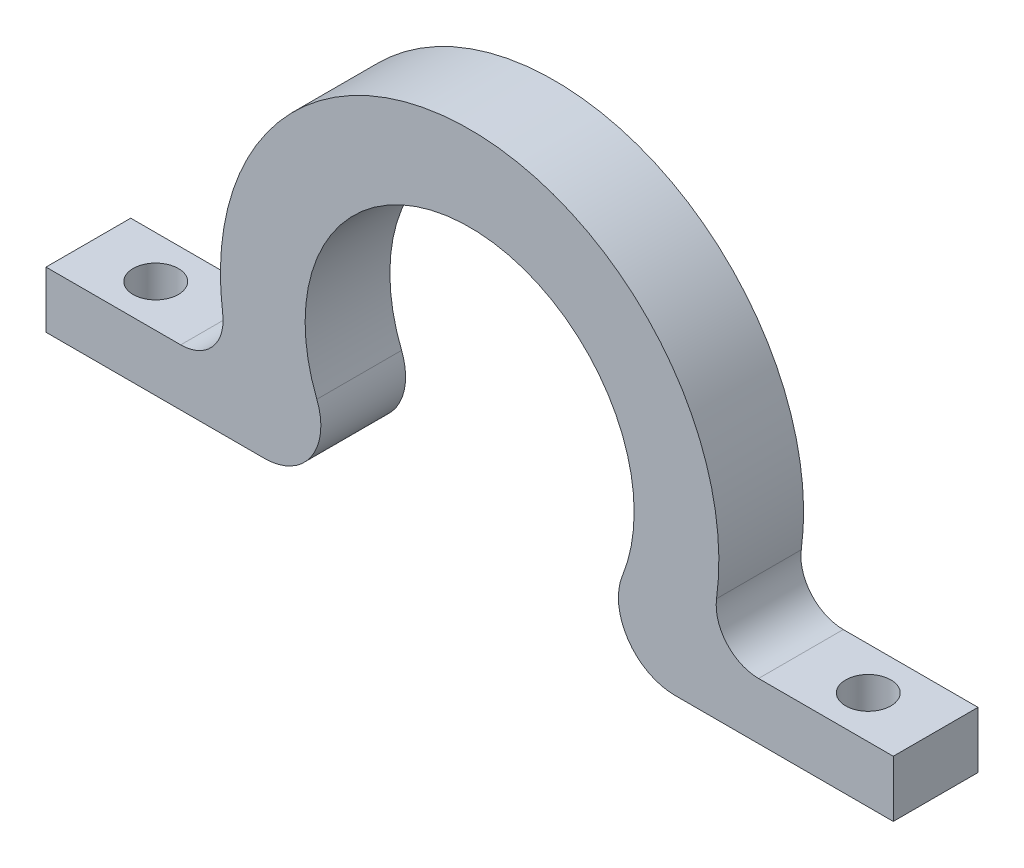
ISO-10303-21;
HEADER;
FILE_DESCRIPTION(('STEP AP214'),'2;1');
FILE_NAME('part.step','',(''),(''),'','','');
FILE_SCHEMA(('AUTOMOTIVE_DESIGN { 1 0 10303 214 1 1 1 1 }'));
ENDSEC;
DATA;
#1=APPLICATION_CONTEXT('core data for automotive mechanical design processes');
#2=APPLICATION_PROTOCOL_DEFINITION('international standard','automotive_design',2000,#1);
#3=PRODUCT_CONTEXT('',#1,'mechanical');
#4=PRODUCT('Part','Part','',(#3));
#5=PRODUCT_RELATED_PRODUCT_CATEGORY('part','',(#4));
#6=PRODUCT_DEFINITION_FORMATION('','',#4);
#7=PRODUCT_DEFINITION_CONTEXT('part definition',#1,'design');
#8=PRODUCT_DEFINITION('design','',#6,#7);
#9=PRODUCT_DEFINITION_SHAPE('','',#8);
#10=(LENGTH_UNIT() NAMED_UNIT(*) SI_UNIT(.MILLI.,.METRE.));
#11=(NAMED_UNIT(*) PLANE_ANGLE_UNIT() SI_UNIT($,.RADIAN.));
#12=(NAMED_UNIT(*) SI_UNIT($,.STERADIAN.) SOLID_ANGLE_UNIT());
#13=UNCERTAINTY_MEASURE_WITH_UNIT(LENGTH_MEASURE(1.E-05),#10,'distance_accuracy_value','');
#14=(GEOMETRIC_REPRESENTATION_CONTEXT(3) GLOBAL_UNCERTAINTY_ASSIGNED_CONTEXT((#13)) GLOBAL_UNIT_ASSIGNED_CONTEXT((#10,
#11,#12)) REPRESENTATION_CONTEXT('',''));
#15=CARTESIAN_POINT('',(0.,0.,0.));
#16=DIRECTION('',(0.,0.,1.));
#17=DIRECTION('',(1.,0.,0.));
#18=AXIS2_PLACEMENT_3D('',#15,#16,#17);
#19=CARTESIAN_POINT('',(-30.,-9.8,6.));
#20=DIRECTION('',(1.,0.,0.));
#21=DIRECTION('',(0.,0.,-1.));
#22=AXIS2_PLACEMENT_3D('',#19,#20,#21);
#23=PLANE('',#22);
#24=DIRECTION('',(0.,-1.,0.));
#25=VECTOR('',#24,1.);
#26=CARTESIAN_POINT('',(-30.,-9.8,0.));
#27=LINE('',#26,#25);
#28=CARTESIAN_POINT('',(-30.,-5.80000000000001,0.));
#29=VERTEX_POINT('',#28);
#30=CARTESIAN_POINT('',(-30.,-9.8,0.));
#31=VERTEX_POINT('',#30);
#32=EDGE_CURVE('E169',#29,#31,#27,.T.);
#33=ORIENTED_EDGE('',*,*,#32,.T.);
#34=DIRECTION('',(0.,0.,-1.));
#35=VECTOR('',#34,1.);
#36=CARTESIAN_POINT('',(-30.,-9.8,6.));
#37=LINE('',#36,#35);
#38=CARTESIAN_POINT('',(-30.,-9.8,6.));
#39=VERTEX_POINT('',#38);
#40=EDGE_CURVE('E11',#39,#31,#37,.T.);
#41=ORIENTED_EDGE('',*,*,#40,.F.);
#42=DIRECTION('',(0.,-1.,0.));
#43=VECTOR('',#42,1.);
#44=CARTESIAN_POINT('',(-30.,-9.8,6.));
#45=LINE('',#44,#43);
#46=CARTESIAN_POINT('',(-30.,-5.80000000000001,6.));
#47=VERTEX_POINT('',#46);
#48=EDGE_CURVE('E204',#47,#39,#45,.T.);
#49=ORIENTED_EDGE('',*,*,#48,.F.);
#50=DIRECTION('',(0.,0.,-1.));
#51=VECTOR('',#50,1.);
#52=CARTESIAN_POINT('',(-30.,-5.80000000000001,6.));
#53=LINE('',#52,#51);
#54=EDGE_CURVE('E165',#47,#29,#53,.T.);
#55=ORIENTED_EDGE('',*,*,#54,.T.);
#56=EDGE_LOOP('',(#33,#41,#49,#55));
#57=FACE_BOUND('',#56,.T.);
#58=ADVANCED_FACE('F44',(#57),#23,.F.);
#59=CARTESIAN_POINT('',(-14.5355598447394,-9.8,6.));
#60=DIRECTION('',(0.,1.,0.));
#61=DIRECTION('',(-1.,0.,0.));
#62=AXIS2_PLACEMENT_3D('',#59,#60,#61);
#63=PLANE('',#62);
#64=CARTESIAN_POINT('',(-25.2296444219728,-9.8,3.));
#65=DIRECTION('',(0.,1.,0.));
#66=DIRECTION('',(0.,0.,1.));
#67=AXIS2_PLACEMENT_3D('',#64,#65,#66);
#68=CIRCLE('',#67,1.6);
#69=CARTESIAN_POINT('',(-25.2296444219728,-9.8,4.6));
#70=VERTEX_POINT('',#69);
#71=EDGE_CURVE('E174',#70,#70,#68,.T.);
#72=ORIENTED_EDGE('',*,*,#71,.T.);
#73=EDGE_LOOP('',(#72));
#74=FACE_BOUND('',#73,.T.);
#75=DIRECTION('',(1.,0.,0.));
#76=VECTOR('',#75,1.);
#77=CARTESIAN_POINT('',(-14.5355598447394,-9.8,0.));
#78=LINE('',#77,#76);
#79=CARTESIAN_POINT('',(-14.5355598447394,-9.8,0.));
#80=VERTEX_POINT('',#79);
#81=EDGE_CURVE('E173',#31,#80,#78,.T.);
#82=ORIENTED_EDGE('',*,*,#81,.T.);
#83=DIRECTION('',(0.,0.,-1.));
#84=VECTOR('',#83,1.);
#85=CARTESIAN_POINT('',(-14.5355598447394,-9.8,6.));
#86=LINE('',#85,#84);
#87=CARTESIAN_POINT('',(-14.5355598447394,-9.8,6.));
#88=VERTEX_POINT('',#87);
#89=EDGE_CURVE('E53',#88,#80,#86,.T.);
#90=ORIENTED_EDGE('',*,*,#89,.F.);
#91=DIRECTION('',(1.,0.,0.));
#92=VECTOR('',#91,1.);
#93=CARTESIAN_POINT('',(-14.5355598447394,-9.8,6.));
#94=LINE('',#93,#92);
#95=EDGE_CURVE('E116',#39,#88,#94,.T.);
#96=ORIENTED_EDGE('',*,*,#95,.F.);
#97=ORIENTED_EDGE('',*,*,#40,.T.);
#98=EDGE_LOOP('',(#82,#90,#96,#97));
#99=FACE_BOUND('',#98,.T.);
#100=ADVANCED_FACE('F302',(#74,#99),#63,.F.);
#101=CARTESIAN_POINT('',(-14.5355598447394,-5.8,6.));
#102=DIRECTION('',(0.,0.,-1.));
#103=DIRECTION('',(-1.,0.,0.));
#104=AXIS2_PLACEMENT_3D('',#101,#102,#103);
#105=CYLINDRICAL_SURFACE('',#104,4.);
#106=CARTESIAN_POINT('',(-14.5355598447394,-5.8,0.));
#107=DIRECTION('',(0.,0.,1.));
#108=DIRECTION('',(1.,0.,0.));
#109=AXIS2_PLACEMENT_3D('',#106,#107,#108);
#110=CIRCLE('',#109,4.);
#111=CARTESIAN_POINT('',(-10.8204007789913,-4.31757188498403,0.));
#112=VERTEX_POINT('',#111);
#113=EDGE_CURVE('E177',#80,#112,#110,.T.);
#114=ORIENTED_EDGE('',*,*,#113,.T.);
#115=DIRECTION('',(0.,0.,-1.));
#116=VECTOR('',#115,1.);
#117=CARTESIAN_POINT('',(-10.8204007789913,-4.31757188498403,6.));
#118=LINE('',#117,#116);
#119=CARTESIAN_POINT('',(-10.8204007789913,-4.31757188498403,6.));
#120=VERTEX_POINT('',#119);
#121=EDGE_CURVE('E231',#120,#112,#118,.T.);
#122=ORIENTED_EDGE('',*,*,#121,.F.);
#123=CARTESIAN_POINT('',(-14.5355598447394,-5.8,6.));
#124=DIRECTION('',(0.,0.,1.));
#125=DIRECTION('',(1.,0.,0.));
#126=AXIS2_PLACEMENT_3D('',#123,#124,#125);
#127=CIRCLE('',#126,4.);
#128=EDGE_CURVE('E241',#88,#120,#127,.T.);
#129=ORIENTED_EDGE('',*,*,#128,.F.);
#130=ORIENTED_EDGE('',*,*,#89,.T.);
#131=EDGE_LOOP('',(#114,#122,#129,#130));
#132=FACE_BOUND('',#131,.T.);
#133=ADVANCED_FACE('F239',(#132),#105,.T.);
#134=CARTESIAN_POINT('',(0.,0.,6.));
#135=DIRECTION('',(0.,0.,-1.));
#136=DIRECTION('',(-1.,0.,0.));
#137=AXIS2_PLACEMENT_3D('',#134,#135,#136);
#138=CYLINDRICAL_SURFACE('',#137,11.65);
#139=CARTESIAN_POINT('',(0.,0.,0.));
#140=DIRECTION('',(0.,0.,-1.));
#141=DIRECTION('',(1.,0.,0.));
#142=AXIS2_PLACEMENT_3D('',#139,#140,#141);
#143=CIRCLE('',#142,11.65);
#144=CARTESIAN_POINT('',(10.8204007789913,-4.31757188498403,0.));
#145=VERTEX_POINT('',#144);
#146=EDGE_CURVE('E180',#112,#145,#143,.T.);
#147=ORIENTED_EDGE('',*,*,#146,.T.);
#148=DIRECTION('',(0.,0.,-1.));
#149=VECTOR('',#148,1.);
#150=CARTESIAN_POINT('',(10.8204007789913,-4.31757188498403,6.));
#151=LINE('',#150,#149);
#152=CARTESIAN_POINT('',(10.8204007789913,-4.31757188498403,6.));
#153=VERTEX_POINT('',#152);
#154=EDGE_CURVE('E227',#153,#145,#151,.T.);
#155=ORIENTED_EDGE('',*,*,#154,.F.);
#156=CARTESIAN_POINT('',(0.,0.,6.));
#157=DIRECTION('',(0.,0.,-1.));
#158=DIRECTION('',(1.,0.,0.));
#159=AXIS2_PLACEMENT_3D('',#156,#157,#158);
#160=CIRCLE('',#159,11.65);
#161=EDGE_CURVE('E260',#120,#153,#160,.T.);
#162=ORIENTED_EDGE('',*,*,#161,.F.);
#163=ORIENTED_EDGE('',*,*,#121,.T.);
#164=EDGE_LOOP('',(#147,#155,#162,#163));
#165=FACE_BOUND('',#164,.T.);
#166=ADVANCED_FACE('F250',(#165),#138,.F.);
#167=CARTESIAN_POINT('',(14.5355598447394,-5.8,6.));
#168=DIRECTION('',(0.,0.,-1.));
#169=DIRECTION('',(-1.,0.,0.));
#170=AXIS2_PLACEMENT_3D('',#167,#168,#169);
#171=CYLINDRICAL_SURFACE('',#170,4.);
#172=CARTESIAN_POINT('',(14.5355598447394,-5.8,0.));
#173=DIRECTION('',(0.,0.,1.));
#174=DIRECTION('',(-1.,0.,0.));
#175=AXIS2_PLACEMENT_3D('',#172,#173,#174);
#176=CIRCLE('',#175,4.);
#177=CARTESIAN_POINT('',(14.5355598447394,-9.8,0.));
#178=VERTEX_POINT('',#177);
#179=EDGE_CURVE('E183',#145,#178,#176,.T.);
#180=ORIENTED_EDGE('',*,*,#179,.T.);
#181=DIRECTION('',(0.,0.,-1.));
#182=VECTOR('',#181,1.);
#183=CARTESIAN_POINT('',(14.5355598447394,-9.8,6.));
#184=LINE('',#183,#182);
#185=CARTESIAN_POINT('',(14.5355598447394,-9.8,6.));
#186=VERTEX_POINT('',#185);
#187=EDGE_CURVE('E223',#186,#178,#184,.T.);
#188=ORIENTED_EDGE('',*,*,#187,.F.);
#189=CARTESIAN_POINT('',(14.5355598447394,-5.8,6.));
#190=DIRECTION('',(0.,0.,1.));
#191=DIRECTION('',(-1.,0.,0.));
#192=AXIS2_PLACEMENT_3D('',#189,#190,#191);
#193=CIRCLE('',#192,4.);
#194=EDGE_CURVE('E256',#153,#186,#193,.T.);
#195=ORIENTED_EDGE('',*,*,#194,.F.);
#196=ORIENTED_EDGE('',*,*,#154,.T.);
#197=EDGE_LOOP('',(#180,#188,#195,#196));
#198=FACE_BOUND('',#197,.T.);
#199=ADVANCED_FACE('F254',(#198),#171,.T.);
#200=CARTESIAN_POINT('',(14.5355598447394,-9.8,6.));
#201=DIRECTION('',(0.,1.,0.));
#202=DIRECTION('',(-1.,0.,0.));
#203=AXIS2_PLACEMENT_3D('',#200,#201,#202);
#204=PLANE('',#203);
#205=CARTESIAN_POINT('',(25.2296444219728,-9.8,3.));
#206=DIRECTION('',(0.,1.,0.));
#207=DIRECTION('',(0.,0.,-1.));
#208=AXIS2_PLACEMENT_3D('',#205,#206,#207);
#209=CIRCLE('',#208,1.6);
#210=CARTESIAN_POINT('',(25.2296444219728,-9.8,1.4));
#211=VERTEX_POINT('',#210);
#212=EDGE_CURVE('E376',#211,#211,#209,.T.);
#213=ORIENTED_EDGE('',*,*,#212,.T.);
#214=EDGE_LOOP('',(#213));
#215=FACE_BOUND('',#214,.T.);
#216=DIRECTION('',(1.,0.,0.));
#217=VECTOR('',#216,1.);
#218=CARTESIAN_POINT('',(14.5355598447394,-9.8,0.));
#219=LINE('',#218,#217);
#220=CARTESIAN_POINT('',(30.,-9.8,0.));
#221=VERTEX_POINT('',#220);
#222=EDGE_CURVE('E186',#178,#221,#219,.T.);
#223=ORIENTED_EDGE('',*,*,#222,.T.);
#224=DIRECTION('',(0.,0.,-1.));
#225=VECTOR('',#224,1.);
#226=CARTESIAN_POINT('',(30.,-9.8,6.));
#227=LINE('',#226,#225);
#228=CARTESIAN_POINT('',(30.,-9.8,6.));
#229=VERTEX_POINT('',#228);
#230=EDGE_CURVE('E219',#229,#221,#227,.T.);
#231=ORIENTED_EDGE('',*,*,#230,.F.);
#232=DIRECTION('',(1.,0.,0.));
#233=VECTOR('',#232,1.);
#234=CARTESIAN_POINT('',(14.5355598447394,-9.8,6.));
#235=LINE('',#234,#233);
#236=EDGE_CURVE('E259',#186,#229,#235,.T.);
#237=ORIENTED_EDGE('',*,*,#236,.F.);
#238=ORIENTED_EDGE('',*,*,#187,.T.);
#239=EDGE_LOOP('',(#223,#231,#237,#238));
#240=FACE_BOUND('',#239,.T.);
#241=ADVANCED_FACE('F319',(#215,#240),#204,.F.);
#242=CARTESIAN_POINT('',(30.,-9.8,6.));
#243=DIRECTION('',(-1.,0.,0.));
#244=DIRECTION('',(0.,0.,1.));
#245=AXIS2_PLACEMENT_3D('',#242,#243,#244);
#246=PLANE('',#245);
#247=DIRECTION('',(0.,1.,0.));
#248=VECTOR('',#247,1.);
#249=CARTESIAN_POINT('',(30.,-9.8,0.));
#250=LINE('',#249,#248);
#251=CARTESIAN_POINT('',(30.,-5.80000000000001,0.));
#252=VERTEX_POINT('',#251);
#253=EDGE_CURVE('E189',#221,#252,#250,.T.);
#254=ORIENTED_EDGE('',*,*,#253,.T.);
#255=DIRECTION('',(0.,0.,-1.));
#256=VECTOR('',#255,1.);
#257=CARTESIAN_POINT('',(30.,-5.80000000000001,6.));
#258=LINE('',#257,#256);
#259=CARTESIAN_POINT('',(30.,-5.80000000000001,6.));
#260=VERTEX_POINT('',#259);
#261=EDGE_CURVE('E215',#260,#252,#258,.T.);
#262=ORIENTED_EDGE('',*,*,#261,.F.);
#263=DIRECTION('',(0.,1.,0.));
#264=VECTOR('',#263,1.);
#265=CARTESIAN_POINT('',(30.,-9.8,6.));
#266=LINE('',#265,#264);
#267=EDGE_CURVE('E264',#229,#260,#266,.T.);
#268=ORIENTED_EDGE('',*,*,#267,.F.);
#269=ORIENTED_EDGE('',*,*,#230,.T.);
#270=EDGE_LOOP('',(#254,#262,#268,#269));
#271=FACE_BOUND('',#270,.T.);
#272=ADVANCED_FACE('F321',(#271),#246,.F.);
#273=CARTESIAN_POINT('',(30.,-5.80000000000001,6.));
#274=DIRECTION('',(0.,-1.,0.));
#275=DIRECTION('',(0.,0.,-1.));
#276=AXIS2_PLACEMENT_3D('',#273,#274,#275);
#277=PLANE('',#276);
#278=CARTESIAN_POINT('',(25.2296444219728,-5.80000000000001,3.));
#279=DIRECTION('',(0.,1.,0.));
#280=DIRECTION('',(0.,0.,-1.));
#281=AXIS2_PLACEMENT_3D('',#278,#279,#280);
#282=CIRCLE('',#281,1.6);
#283=CARTESIAN_POINT('',(25.2296444219728,-5.80000000000001,1.4));
#284=VERTEX_POINT('',#283);
#285=EDGE_CURVE('E379',#284,#284,#282,.T.);
#286=ORIENTED_EDGE('',*,*,#285,.F.);
#287=EDGE_LOOP('',(#286));
#288=FACE_BOUND('',#287,.T.);
#289=DIRECTION('',(-1.,0.,0.));
#290=VECTOR('',#289,1.);
#291=CARTESIAN_POINT('',(30.,-5.80000000000001,0.));
#292=LINE('',#291,#290);
#293=CARTESIAN_POINT('',(20.4592888439457,-5.80000000000001,0.));
#294=VERTEX_POINT('',#293);
#295=EDGE_CURVE('E192',#252,#294,#292,.T.);
#296=ORIENTED_EDGE('',*,*,#295,.T.);
#297=DIRECTION('',(0.,0.,-1.));
#298=VECTOR('',#297,1.);
#299=CARTESIAN_POINT('',(20.4592888439457,-5.80000000000001,6.));
#300=LINE('',#299,#298);
#301=CARTESIAN_POINT('',(20.4592888439457,-5.80000000000001,6.));
#302=VERTEX_POINT('',#301);
#303=EDGE_CURVE('E211',#302,#294,#300,.T.);
#304=ORIENTED_EDGE('',*,*,#303,.F.);
#305=DIRECTION('',(-1.,0.,0.));
#306=VECTOR('',#305,1.);
#307=CARTESIAN_POINT('',(30.,-5.80000000000001,6.));
#308=LINE('',#307,#306);
#309=EDGE_CURVE('E271',#260,#302,#308,.T.);
#310=ORIENTED_EDGE('',*,*,#309,.F.);
#311=ORIENTED_EDGE('',*,*,#261,.T.);
#312=EDGE_LOOP('',(#296,#304,#310,#311));
#313=FACE_BOUND('',#312,.T.);
#314=ADVANCED_FACE('F279',(#288,#313),#277,.F.);
#315=CARTESIAN_POINT('',(20.4592888439457,-2.8,6.));
#316=DIRECTION('',(0.,0.,-1.));
#317=DIRECTION('',(-1.,0.,0.));
#318=AXIS2_PLACEMENT_3D('',#315,#316,#317);
#319=CYLINDRICAL_SURFACE('',#318,3.);
#320=CARTESIAN_POINT('',(20.4592888439457,-2.8,0.));
#321=DIRECTION('',(0.,0.,-1.));
#322=DIRECTION('',(1.,0.,0.));
#323=AXIS2_PLACEMENT_3D('',#320,#321,#322);
#324=CIRCLE('',#323,3.);
#325=CARTESIAN_POINT('',(17.4869950651642,-2.39322033898305,0.));
#326=VERTEX_POINT('',#325);
#327=EDGE_CURVE('E195',#294,#326,#324,.T.);
#328=ORIENTED_EDGE('',*,*,#327,.T.);
#329=DIRECTION('',(0.,0.,-1.));
#330=VECTOR('',#329,1.);
#331=CARTESIAN_POINT('',(17.4869950651642,-2.39322033898305,6.));
#332=LINE('',#331,#330);
#333=CARTESIAN_POINT('',(17.4869950651642,-2.39322033898305,6.));
#334=VERTEX_POINT('',#333);
#335=EDGE_CURVE('E158',#334,#326,#332,.T.);
#336=ORIENTED_EDGE('',*,*,#335,.F.);
#337=CARTESIAN_POINT('',(20.4592888439457,-2.8,6.));
#338=DIRECTION('',(0.,0.,-1.));
#339=DIRECTION('',(1.,0.,0.));
#340=AXIS2_PLACEMENT_3D('',#337,#338,#339);
#341=CIRCLE('',#340,3.);
#342=EDGE_CURVE('E147',#302,#334,#341,.T.);
#343=ORIENTED_EDGE('',*,*,#342,.F.);
#344=ORIENTED_EDGE('',*,*,#303,.T.);
#345=EDGE_LOOP('',(#328,#336,#343,#344));
#346=FACE_BOUND('',#345,.T.);
#347=ADVANCED_FACE('F283',(#346),#319,.F.);
#348=CARTESIAN_POINT('',(0.,0.,6.));
#349=DIRECTION('',(0.,0.,-1.));
#350=DIRECTION('',(-1.,0.,0.));
#351=AXIS2_PLACEMENT_3D('',#348,#349,#350);
#352=CYLINDRICAL_SURFACE('',#351,17.65);
#353=CARTESIAN_POINT('',(0.,0.,0.));
#354=DIRECTION('',(0.,0.,1.));
#355=DIRECTION('',(1.,0.,0.));
#356=AXIS2_PLACEMENT_3D('',#353,#354,#355);
#357=CIRCLE('',#356,17.65);
#358=CARTESIAN_POINT('',(-17.4869950651642,-2.39322033898305,0.));
#359=VERTEX_POINT('',#358);
#360=EDGE_CURVE('E156',#326,#359,#357,.T.);
#361=ORIENTED_EDGE('',*,*,#360,.T.);
#362=DIRECTION('',(0.,0.,-1.));
#363=VECTOR('',#362,1.);
#364=CARTESIAN_POINT('',(-17.4869950651642,-2.39322033898305,6.));
#365=LINE('',#364,#363);
#366=CARTESIAN_POINT('',(-17.4869950651642,-2.39322033898305,6.));
#367=VERTEX_POINT('',#366);
#368=EDGE_CURVE('E153',#367,#359,#365,.T.);
#369=ORIENTED_EDGE('',*,*,#368,.F.);
#370=CARTESIAN_POINT('',(0.,0.,6.));
#371=DIRECTION('',(0.,0.,1.));
#372=DIRECTION('',(1.,0.,0.));
#373=AXIS2_PLACEMENT_3D('',#370,#371,#372);
#374=CIRCLE('',#373,17.65);
#375=EDGE_CURVE('E141',#334,#367,#374,.T.);
#376=ORIENTED_EDGE('',*,*,#375,.F.);
#377=ORIENTED_EDGE('',*,*,#335,.T.);
#378=EDGE_LOOP('',(#361,#369,#376,#377));
#379=FACE_BOUND('',#378,.T.);
#380=ADVANCED_FACE('F154',(#379),#352,.T.);
#381=CARTESIAN_POINT('',(-20.4592888439457,-2.8,6.));
#382=DIRECTION('',(0.,0.,-1.));
#383=DIRECTION('',(-1.,0.,0.));
#384=AXIS2_PLACEMENT_3D('',#381,#382,#383);
#385=CYLINDRICAL_SURFACE('',#384,3.);
#386=CARTESIAN_POINT('',(-20.4592888439457,-2.8,0.));
#387=DIRECTION('',(0.,0.,-1.));
#388=DIRECTION('',(-1.,0.,0.));
#389=AXIS2_PLACEMENT_3D('',#386,#387,#388);
#390=CIRCLE('',#389,3.);
#391=CARTESIAN_POINT('',(-20.4592888439457,-5.8,0.));
#392=VERTEX_POINT('',#391);
#393=EDGE_CURVE('E102',#359,#392,#390,.T.);
#394=ORIENTED_EDGE('',*,*,#393,.T.);
#395=DIRECTION('',(0.,0.,-1.));
#396=VECTOR('',#395,1.);
#397=CARTESIAN_POINT('',(-20.4592888439457,-5.8,6.));
#398=LINE('',#397,#396);
#399=CARTESIAN_POINT('',(-20.4592888439457,-5.8,6.));
#400=VERTEX_POINT('',#399);
#401=EDGE_CURVE('E159',#400,#392,#398,.T.);
#402=ORIENTED_EDGE('',*,*,#401,.F.);
#403=CARTESIAN_POINT('',(-20.4592888439457,-2.8,6.));
#404=DIRECTION('',(0.,0.,-1.));
#405=DIRECTION('',(-1.,0.,0.));
#406=AXIS2_PLACEMENT_3D('',#403,#404,#405);
#407=CIRCLE('',#406,3.);
#408=EDGE_CURVE('E145',#367,#400,#407,.T.);
#409=ORIENTED_EDGE('',*,*,#408,.F.);
#410=ORIENTED_EDGE('',*,*,#368,.T.);
#411=EDGE_LOOP('',(#394,#402,#409,#410));
#412=FACE_BOUND('',#411,.T.);
#413=ADVANCED_FACE('F161',(#412),#385,.F.);
#414=CARTESIAN_POINT('',(-30.,-5.80000000000001,6.));
#415=DIRECTION('',(0.,-1.,0.));
#416=DIRECTION('',(0.,0.,-1.));
#417=AXIS2_PLACEMENT_3D('',#414,#415,#416);
#418=PLANE('',#417);
#419=CARTESIAN_POINT('',(-25.2296444219728,-5.80000000000001,3.));
#420=DIRECTION('',(0.,1.,0.));
#421=DIRECTION('',(0.,0.,1.));
#422=AXIS2_PLACEMENT_3D('',#419,#420,#421);
#423=CIRCLE('',#422,1.6);
#424=CARTESIAN_POINT('',(-25.2296444219728,-5.80000000000001,4.6));
#425=VERTEX_POINT('',#424);
#426=EDGE_CURVE('E381',#425,#425,#423,.T.);
#427=ORIENTED_EDGE('',*,*,#426,.F.);
#428=EDGE_LOOP('',(#427));
#429=FACE_BOUND('',#428,.T.);
#430=DIRECTION('',(-1.,0.,0.));
#431=VECTOR('',#430,1.);
#432=CARTESIAN_POINT('',(-30.,-5.80000000000001,0.));
#433=LINE('',#432,#431);
#434=EDGE_CURVE('E108',#392,#29,#433,.T.);
#435=ORIENTED_EDGE('',*,*,#434,.T.);
#436=ORIENTED_EDGE('',*,*,#54,.F.);
#437=DIRECTION('',(-1.,0.,0.));
#438=VECTOR('',#437,1.);
#439=CARTESIAN_POINT('',(-30.,-5.80000000000001,6.));
#440=LINE('',#439,#438);
#441=EDGE_CURVE('E61',#400,#47,#440,.T.);
#442=ORIENTED_EDGE('',*,*,#441,.F.);
#443=ORIENTED_EDGE('',*,*,#401,.T.);
#444=EDGE_LOOP('',(#435,#436,#442,#443));
#445=FACE_BOUND('',#444,.T.);
#446=ADVANCED_FACE('F287',(#429,#445),#418,.F.);
#447=CARTESIAN_POINT('',(-20.4592888439457,-2.8,6.));
#448=DIRECTION('',(0.,0.,-1.));
#449=DIRECTION('',(-1.,0.,0.));
#450=AXIS2_PLACEMENT_3D('',#447,#448,#449);
#451=PLANE('',#450);
#452=ORIENTED_EDGE('',*,*,#48,.T.);
#453=ORIENTED_EDGE('',*,*,#95,.T.);
#454=ORIENTED_EDGE('',*,*,#128,.T.);
#455=ORIENTED_EDGE('',*,*,#161,.T.);
#456=ORIENTED_EDGE('',*,*,#194,.T.);
#457=ORIENTED_EDGE('',*,*,#236,.T.);
#458=ORIENTED_EDGE('',*,*,#267,.T.);
#459=ORIENTED_EDGE('',*,*,#309,.T.);
#460=ORIENTED_EDGE('',*,*,#342,.T.);
#461=ORIENTED_EDGE('',*,*,#375,.T.);
#462=ORIENTED_EDGE('',*,*,#408,.T.);
#463=ORIENTED_EDGE('',*,*,#441,.T.);
#464=EDGE_LOOP('',(#452,#453,#454,#455,#456,#457,#458,#459,#460,#461,#462,#463));
#465=FACE_BOUND('',#464,.T.);
#466=ADVANCED_FACE('F143',(#465),#451,.F.);
#467=CARTESIAN_POINT('',(-20.4592888439457,-2.8,0.));
#468=DIRECTION('',(0.,0.,-1.));
#469=DIRECTION('',(-1.,0.,0.));
#470=AXIS2_PLACEMENT_3D('',#467,#468,#469);
#471=PLANE('',#470);
#472=ORIENTED_EDGE('',*,*,#32,.F.);
#473=ORIENTED_EDGE('',*,*,#434,.F.);
#474=ORIENTED_EDGE('',*,*,#393,.F.);
#475=ORIENTED_EDGE('',*,*,#360,.F.);
#476=ORIENTED_EDGE('',*,*,#327,.F.);
#477=ORIENTED_EDGE('',*,*,#295,.F.);
#478=ORIENTED_EDGE('',*,*,#253,.F.);
#479=ORIENTED_EDGE('',*,*,#222,.F.);
#480=ORIENTED_EDGE('',*,*,#179,.F.);
#481=ORIENTED_EDGE('',*,*,#146,.F.);
#482=ORIENTED_EDGE('',*,*,#113,.F.);
#483=ORIENTED_EDGE('',*,*,#81,.F.);
#484=EDGE_LOOP('',(#472,#473,#474,#475,#476,#477,#478,#479,#480,#481,#482,#483));
#485=FACE_BOUND('',#484,.T.);
#486=ADVANCED_FACE('F245',(#485),#471,.T.);
#487=CARTESIAN_POINT('',(-25.2296444219728,-9.8,3.));
#488=DIRECTION('',(0.,1.,0.));
#489=DIRECTION('',(0.,0.,1.));
#490=AXIS2_PLACEMENT_3D('',#487,#488,#489);
#491=CYLINDRICAL_SURFACE('',#490,1.6);
#492=ORIENTED_EDGE('',*,*,#71,.F.);
#493=EDGE_LOOP('',(#492));
#494=FACE_BOUND('',#493,.T.);
#495=ORIENTED_EDGE('',*,*,#426,.T.);
#496=EDGE_LOOP('',(#495));
#497=FACE_BOUND('',#496,.T.);
#498=ADVANCED_FACE('F350',(#494,#497),#491,.F.);
#499=CARTESIAN_POINT('',(25.2296444219728,-9.8,3.));
#500=DIRECTION('',(0.,1.,0.));
#501=DIRECTION('',(0.,0.,1.));
#502=AXIS2_PLACEMENT_3D('',#499,#500,#501);
#503=CYLINDRICAL_SURFACE('',#502,1.6);
#504=ORIENTED_EDGE('',*,*,#212,.F.);
#505=EDGE_LOOP('',(#504));
#506=FACE_BOUND('',#505,.T.);
#507=ORIENTED_EDGE('',*,*,#285,.T.);
#508=EDGE_LOOP('',(#507));
#509=FACE_BOUND('',#508,.T.);
#510=ADVANCED_FACE('F360',(#506,#509),#503,.F.);
#511=CLOSED_SHELL('',(#58,#100,#133,#166,#199,#241,#272,#314,#347,#380,#413,#446,#466,#486,#498,#510));
#512=MANIFOLD_SOLID_BREP('B2',#511);
#513=ADVANCED_BREP_SHAPE_REPRESENTATION('',(#18,#512),#14);
#514=SHAPE_DEFINITION_REPRESENTATION(#9,#513);
ENDSEC;
END-ISO-10303-21;
